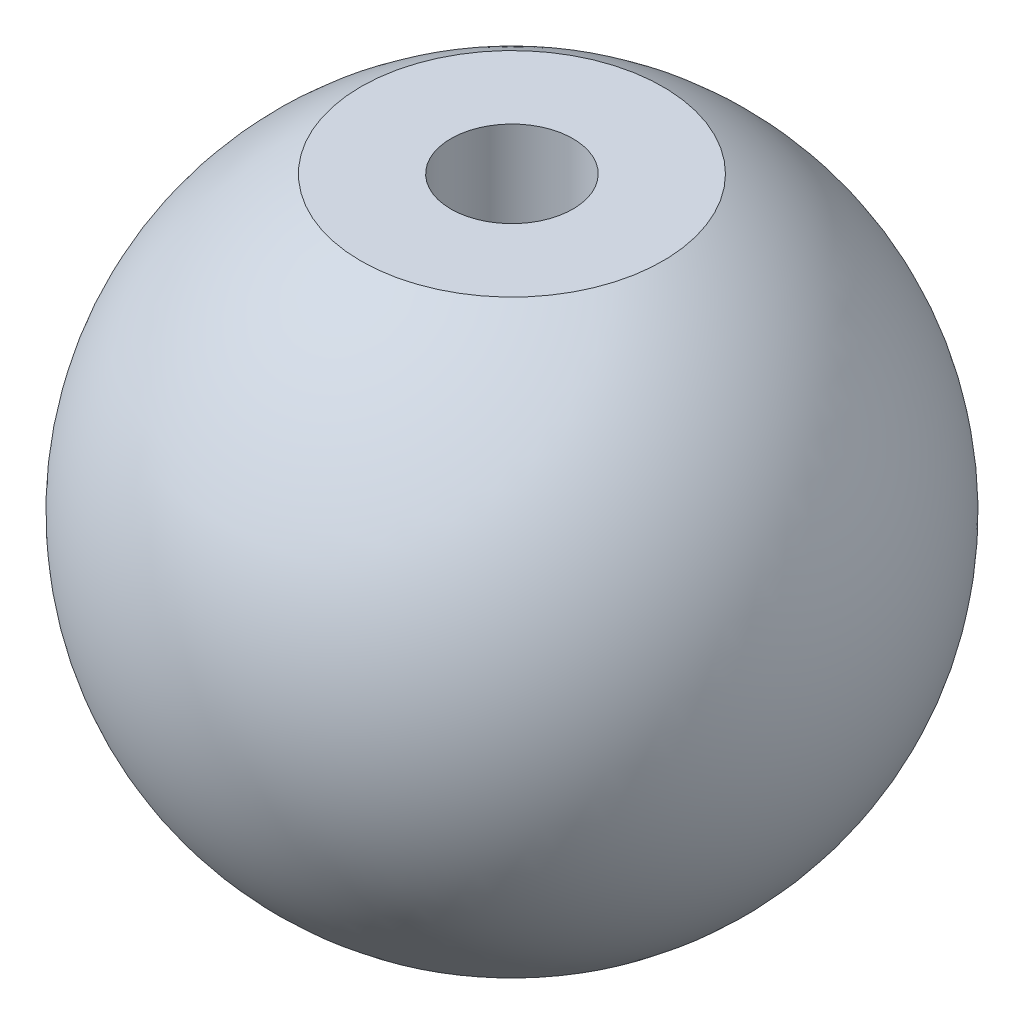
ISO-10303-21;
HEADER;
FILE_DESCRIPTION(('STEP AP214'),'2;1');
FILE_NAME('part.step','',(''),(''),'','','');
FILE_SCHEMA(('AUTOMOTIVE_DESIGN { 1 0 10303 214 1 1 1 1 }'));
ENDSEC;
DATA;
#1=APPLICATION_CONTEXT('core data for automotive mechanical design processes');
#2=APPLICATION_PROTOCOL_DEFINITION('international standard','automotive_design',2000,#1);
#3=PRODUCT_CONTEXT('',#1,'mechanical');
#4=PRODUCT('Part','Part','',(#3));
#5=PRODUCT_RELATED_PRODUCT_CATEGORY('part','',(#4));
#6=PRODUCT_DEFINITION_FORMATION('','',#4);
#7=PRODUCT_DEFINITION_CONTEXT('part definition',#1,'design');
#8=PRODUCT_DEFINITION('design','',#6,#7);
#9=PRODUCT_DEFINITION_SHAPE('','',#8);
#10=(LENGTH_UNIT() NAMED_UNIT(*) SI_UNIT(.MILLI.,.METRE.));
#11=(NAMED_UNIT(*) PLANE_ANGLE_UNIT() SI_UNIT($,.RADIAN.));
#12=(NAMED_UNIT(*) SI_UNIT($,.STERADIAN.) SOLID_ANGLE_UNIT());
#13=UNCERTAINTY_MEASURE_WITH_UNIT(LENGTH_MEASURE(1.E-05),#10,'distance_accuracy_value','');
#14=(GEOMETRIC_REPRESENTATION_CONTEXT(3) GLOBAL_UNCERTAINTY_ASSIGNED_CONTEXT((#13)) GLOBAL_UNIT_ASSIGNED_CONTEXT((#10,
#11,#12)) REPRESENTATION_CONTEXT('',''));
#15=CARTESIAN_POINT('',(0.,0.,0.));
#16=DIRECTION('',(0.,0.,1.));
#17=DIRECTION('',(1.,0.,0.));
#18=AXIS2_PLACEMENT_3D('',#15,#16,#17);
#19=CARTESIAN_POINT('',(0.,0.,0.));
#20=DIRECTION('',(0.,-1.,0.));
#21=DIRECTION('',(-1.,0.,0.));
#22=AXIS2_PLACEMENT_3D('',#19,#20,#21);
#23=SPHERICAL_SURFACE('',#22,13.5);
#24=CARTESIAN_POINT('',(0.,12.,0.));
#25=DIRECTION('',(0.,1.,0.));
#26=DIRECTION('',(0.,0.,1.));
#27=AXIS2_PLACEMENT_3D('',#24,#25,#26);
#28=CIRCLE('',#27,6.18465843842649);
#29=CARTESIAN_POINT('',(0.,12.,6.18465843842649));
#30=VERTEX_POINT('',#29);
#31=EDGE_CURVE('E11',#30,#30,#28,.F.);
#32=ORIENTED_EDGE('',*,*,#31,.T.);
#33=EDGE_LOOP('',(#32));
#34=FACE_BOUND('',#33,.T.);
#35=ADVANCED_FACE('F35',(#34),#23,.T.);
#36=CARTESIAN_POINT('',(0.,12.,0.));
#37=DIRECTION('',(0.,1.,0.));
#38=DIRECTION('',(0.,0.,1.));
#39=AXIS2_PLACEMENT_3D('',#36,#37,#38);
#40=PLANE('',#39);
#41=CARTESIAN_POINT('',(0.,12.,0.));
#42=DIRECTION('',(0.,1.,0.));
#43=DIRECTION('',(0.,0.,1.));
#44=AXIS2_PLACEMENT_3D('',#41,#42,#43);
#45=CIRCLE('',#44,2.49999999999999);
#46=CARTESIAN_POINT('',(0.,12.,2.49999999999999));
#47=VERTEX_POINT('',#46);
#48=EDGE_CURVE('E53',#47,#47,#45,.T.);
#49=ORIENTED_EDGE('',*,*,#48,.F.);
#50=EDGE_LOOP('',(#49));
#51=FACE_BOUND('',#50,.T.);
#52=ORIENTED_EDGE('',*,*,#31,.F.);
#53=EDGE_LOOP('',(#52));
#54=FACE_BOUND('',#53,.T.);
#55=ADVANCED_FACE('F48',(#51,#54),#40,.T.);
#56=CARTESIAN_POINT('',(0.,-3.,0.));
#57=DIRECTION('',(0.,1.,0.));
#58=DIRECTION('',(0.,0.,1.));
#59=AXIS2_PLACEMENT_3D('',#56,#57,#58);
#60=CONICAL_SURFACE('',#59,2.49999999999999,1.02974425867665);
#61=CARTESIAN_POINT('',(0.,-4.5021515475689,0.));
#62=VERTEX_POINT('',#61);
#63=VERTEX_LOOP('',#62);
#64=FACE_BOUND('',#63,.T.);
#65=CARTESIAN_POINT('',(0.,-3.,0.));
#66=DIRECTION('',(0.,1.,0.));
#67=DIRECTION('',(0.,0.,1.));
#68=AXIS2_PLACEMENT_3D('',#65,#66,#67);
#69=CIRCLE('',#68,2.49999999999999);
#70=CARTESIAN_POINT('',(0.,-3.,2.49999999999999));
#71=VERTEX_POINT('',#70);
#72=EDGE_CURVE('E41',#71,#71,#69,.T.);
#73=ORIENTED_EDGE('',*,*,#72,.T.);
#74=EDGE_LOOP('',(#73));
#75=FACE_BOUND('',#74,.T.);
#76=ADVANCED_FACE('F44',(#64,#75),#60,.F.);
#77=CARTESIAN_POINT('',(0.,12.,0.));
#78=DIRECTION('',(0.,1.,0.));
#79=DIRECTION('',(0.,0.,1.));
#80=AXIS2_PLACEMENT_3D('',#77,#78,#79);
#81=CYLINDRICAL_SURFACE('',#80,2.49999999999999);
#82=ORIENTED_EDGE('',*,*,#72,.F.);
#83=EDGE_LOOP('',(#82));
#84=FACE_BOUND('',#83,.T.);
#85=ORIENTED_EDGE('',*,*,#48,.T.);
#86=EDGE_LOOP('',(#85));
#87=FACE_BOUND('',#86,.T.);
#88=ADVANCED_FACE('F47',(#84,#87),#81,.F.);
#89=CLOSED_SHELL('',(#35,#55,#76,#88));
#90=MANIFOLD_SOLID_BREP('B2',#89);
#91=ADVANCED_BREP_SHAPE_REPRESENTATION('',(#18,#90),#14);
#92=SHAPE_DEFINITION_REPRESENTATION(#9,#91);
ENDSEC;
END-ISO-10303-21;
